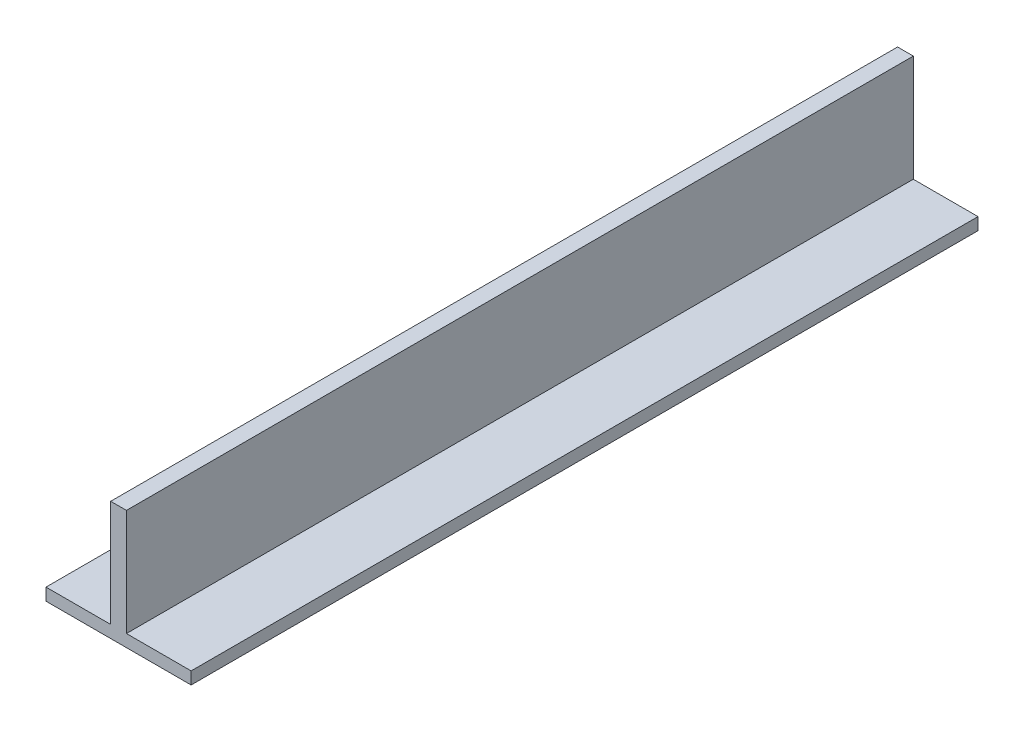
ISO-10303-21;
HEADER;
FILE_DESCRIPTION(('STEP AP214'),'2;1');
FILE_NAME('part.step','',(''),(''),'','','');
FILE_SCHEMA(('AUTOMOTIVE_DESIGN { 1 0 10303 214 1 1 1 1 }'));
ENDSEC;
DATA;
#1=APPLICATION_CONTEXT('core data for automotive mechanical design processes');
#2=APPLICATION_PROTOCOL_DEFINITION('international standard','automotive_design',2000,#1);
#3=PRODUCT_CONTEXT('',#1,'mechanical');
#4=PRODUCT('Part','Part','',(#3));
#5=PRODUCT_RELATED_PRODUCT_CATEGORY('part','',(#4));
#6=PRODUCT_DEFINITION_FORMATION('','',#4);
#7=PRODUCT_DEFINITION_CONTEXT('part definition',#1,'design');
#8=PRODUCT_DEFINITION('design','',#6,#7);
#9=PRODUCT_DEFINITION_SHAPE('','',#8);
#10=(LENGTH_UNIT() NAMED_UNIT(*) SI_UNIT(.MILLI.,.METRE.));
#11=(NAMED_UNIT(*) PLANE_ANGLE_UNIT() SI_UNIT($,.RADIAN.));
#12=(NAMED_UNIT(*) SI_UNIT($,.STERADIAN.) SOLID_ANGLE_UNIT());
#13=UNCERTAINTY_MEASURE_WITH_UNIT(LENGTH_MEASURE(1.E-05),#10,'distance_accuracy_value','');
#14=(GEOMETRIC_REPRESENTATION_CONTEXT(3) GLOBAL_UNCERTAINTY_ASSIGNED_CONTEXT((#13)) GLOBAL_UNIT_ASSIGNED_CONTEXT((#10,
#11,#12)) REPRESENTATION_CONTEXT('',''));
#15=CARTESIAN_POINT('',(0.,0.,0.));
#16=DIRECTION('',(0.,0.,1.));
#17=DIRECTION('',(1.,0.,0.));
#18=AXIS2_PLACEMENT_3D('',#15,#16,#17);
#19=CARTESIAN_POINT('',(0.,7.,450.));
#20=DIRECTION('',(1.,0.,0.));
#21=DIRECTION('',(0.,0.,-1.));
#22=AXIS2_PLACEMENT_3D('',#19,#20,#21);
#23=PLANE('',#22);
#24=DIRECTION('',(0.,0.,-1.));
#25=VECTOR('',#24,1.);
#26=CARTESIAN_POINT('',(0.,7.,450.));
#27=LINE('',#26,#25);
#28=CARTESIAN_POINT('',(0.,7.,450.));
#29=VERTEX_POINT('',#28);
#30=CARTESIAN_POINT('',(0.,7.,224.));
#31=VERTEX_POINT('',#30);
#32=EDGE_CURVE('E120',#29,#31,#27,.T.);
#33=ORIENTED_EDGE('',*,*,#32,.T.);
#34=DIRECTION('',(0.,1.,0.));
#35=VECTOR('',#34,1.);
#36=CARTESIAN_POINT('',(0.,0.,224.));
#37=LINE('',#36,#35);
#38=CARTESIAN_POINT('',(0.,0.,224.));
#39=VERTEX_POINT('',#38);
#40=EDGE_CURVE('E167',#39,#31,#37,.T.);
#41=ORIENTED_EDGE('',*,*,#40,.F.);
#42=DIRECTION('',(0.,0.,-1.));
#43=VECTOR('',#42,1.);
#44=CARTESIAN_POINT('',(0.,0.,450.));
#45=LINE('',#44,#43);
#46=CARTESIAN_POINT('',(0.,0.,450.));
#47=VERTEX_POINT('',#46);
#48=EDGE_CURVE('E11',#47,#39,#45,.T.);
#49=ORIENTED_EDGE('',*,*,#48,.F.);
#50=DIRECTION('',(0.,-1.,0.));
#51=VECTOR('',#50,1.);
#52=CARTESIAN_POINT('',(0.,7.,450.));
#53=LINE('',#52,#51);
#54=EDGE_CURVE('E135',#29,#47,#53,.T.);
#55=ORIENTED_EDGE('',*,*,#54,.F.);
#56=EDGE_LOOP('',(#33,#41,#49,#55));
#57=FACE_BOUND('',#56,.T.);
#58=ADVANCED_FACE('F32',(#57),#23,.F.);
#59=CARTESIAN_POINT('',(0.,0.,450.));
#60=DIRECTION('',(0.,1.,0.));
#61=DIRECTION('',(0.,0.,1.));
#62=AXIS2_PLACEMENT_3D('',#59,#60,#61);
#63=PLANE('',#62);
#64=DIRECTION('',(1.,0.,0.));
#65=VECTOR('',#64,1.);
#66=CARTESIAN_POINT('',(0.,0.,224.));
#67=LINE('',#66,#65);
#68=CARTESIAN_POINT('',(37.,0.,224.));
#69=VERTEX_POINT('',#68);
#70=EDGE_CURVE('E170',#39,#69,#67,.T.);
#71=ORIENTED_EDGE('',*,*,#70,.T.);
#72=DIRECTION('',(0.,0.,-1.));
#73=VECTOR('',#72,1.);
#74=CARTESIAN_POINT('',(37.,0.,224.));
#75=LINE('',#74,#73);
#76=CARTESIAN_POINT('',(37.,0.,0.));
#77=VERTEX_POINT('',#76);
#78=EDGE_CURVE('E175',#69,#77,#75,.T.);
#79=ORIENTED_EDGE('',*,*,#78,.T.);
#80=DIRECTION('',(1.,0.,0.));
#81=VECTOR('',#80,1.);
#82=CARTESIAN_POINT('',(0.,0.,0.));
#83=LINE('',#82,#81);
#84=CARTESIAN_POINT('',(83.,0.,0.));
#85=VERTEX_POINT('',#84);
#86=EDGE_CURVE('E124',#77,#85,#83,.T.);
#87=ORIENTED_EDGE('',*,*,#86,.T.);
#88=DIRECTION('',(0.,0.,-1.));
#89=VECTOR('',#88,1.);
#90=CARTESIAN_POINT('',(83.,0.,450.));
#91=LINE('',#90,#89);
#92=CARTESIAN_POINT('',(83.,0.,450.));
#93=VERTEX_POINT('',#92);
#94=EDGE_CURVE('E40',#93,#85,#91,.T.);
#95=ORIENTED_EDGE('',*,*,#94,.F.);
#96=DIRECTION('',(1.,0.,0.));
#97=VECTOR('',#96,1.);
#98=CARTESIAN_POINT('',(0.,0.,450.));
#99=LINE('',#98,#97);
#100=EDGE_CURVE('E84',#47,#93,#99,.T.);
#101=ORIENTED_EDGE('',*,*,#100,.F.);
#102=ORIENTED_EDGE('',*,*,#48,.T.);
#103=EDGE_LOOP('',(#71,#79,#87,#95,#101,#102));
#104=FACE_BOUND('',#103,.T.);
#105=ADVANCED_FACE('F180',(#104),#63,.F.);
#106=CARTESIAN_POINT('',(83.,0.,450.));
#107=DIRECTION('',(-1.,0.,0.));
#108=DIRECTION('',(0.,0.,1.));
#109=AXIS2_PLACEMENT_3D('',#106,#107,#108);
#110=PLANE('',#109);
#111=DIRECTION('',(0.,1.,0.));
#112=VECTOR('',#111,1.);
#113=CARTESIAN_POINT('',(83.,0.,0.));
#114=LINE('',#113,#112);
#115=CARTESIAN_POINT('',(83.,7.,0.));
#116=VERTEX_POINT('',#115);
#117=EDGE_CURVE('E126',#85,#116,#114,.T.);
#118=ORIENTED_EDGE('',*,*,#117,.T.);
#119=DIRECTION('',(0.,0.,-1.));
#120=VECTOR('',#119,1.);
#121=CARTESIAN_POINT('',(83.,7.,450.));
#122=LINE('',#121,#120);
#123=CARTESIAN_POINT('',(83.,7.,450.));
#124=VERTEX_POINT('',#123);
#125=EDGE_CURVE('E142',#124,#116,#122,.T.);
#126=ORIENTED_EDGE('',*,*,#125,.F.);
#127=DIRECTION('',(0.,1.,0.));
#128=VECTOR('',#127,1.);
#129=CARTESIAN_POINT('',(83.,0.,450.));
#130=LINE('',#129,#128);
#131=EDGE_CURVE('E150',#93,#124,#130,.T.);
#132=ORIENTED_EDGE('',*,*,#131,.F.);
#133=ORIENTED_EDGE('',*,*,#94,.T.);
#134=EDGE_LOOP('',(#118,#126,#132,#133));
#135=FACE_BOUND('',#134,.T.);
#136=ADVANCED_FACE('F148',(#135),#110,.F.);
#137=CARTESIAN_POINT('',(83.,7.,450.));
#138=DIRECTION('',(0.,-1.,0.));
#139=DIRECTION('',(0.,0.,-1.));
#140=AXIS2_PLACEMENT_3D('',#137,#138,#139);
#141=PLANE('',#140);
#142=DIRECTION('',(-1.,0.,0.));
#143=VECTOR('',#142,1.);
#144=CARTESIAN_POINT('',(83.,7.,0.));
#145=LINE('',#144,#143);
#146=CARTESIAN_POINT('',(46.,7.,0.));
#147=VERTEX_POINT('',#146);
#148=EDGE_CURVE('E129',#116,#147,#145,.T.);
#149=ORIENTED_EDGE('',*,*,#148,.T.);
#150=DIRECTION('',(0.,0.,-1.));
#151=VECTOR('',#150,1.);
#152=CARTESIAN_POINT('',(46.,7.,450.));
#153=LINE('',#152,#151);
#154=CARTESIAN_POINT('',(46.,7.,450.));
#155=VERTEX_POINT('',#154);
#156=EDGE_CURVE('E140',#155,#147,#153,.T.);
#157=ORIENTED_EDGE('',*,*,#156,.F.);
#158=DIRECTION('',(-1.,0.,0.));
#159=VECTOR('',#158,1.);
#160=CARTESIAN_POINT('',(83.,7.,450.));
#161=LINE('',#160,#159);
#162=EDGE_CURVE('E161',#124,#155,#161,.T.);
#163=ORIENTED_EDGE('',*,*,#162,.F.);
#164=ORIENTED_EDGE('',*,*,#125,.T.);
#165=EDGE_LOOP('',(#149,#157,#163,#164));
#166=FACE_BOUND('',#165,.T.);
#167=ADVANCED_FACE('F158',(#166),#141,.F.);
#168=CARTESIAN_POINT('',(46.,7.,450.));
#169=DIRECTION('',(-1.,0.,0.));
#170=DIRECTION('',(0.,-1.,0.));
#171=AXIS2_PLACEMENT_3D('',#168,#169,#170);
#172=PLANE('',#171);
#173=DIRECTION('',(0.,1.,0.));
#174=VECTOR('',#173,1.);
#175=CARTESIAN_POINT('',(46.,7.,0.));
#176=LINE('',#175,#174);
#177=CARTESIAN_POINT('',(46.,68.,0.));
#178=VERTEX_POINT('',#177);
#179=EDGE_CURVE('E69',#147,#178,#176,.T.);
#180=ORIENTED_EDGE('',*,*,#179,.T.);
#181=DIRECTION('',(0.,0.,-1.));
#182=VECTOR('',#181,1.);
#183=CARTESIAN_POINT('',(46.,68.,450.));
#184=LINE('',#183,#182);
#185=CARTESIAN_POINT('',(46.,68.,450.));
#186=VERTEX_POINT('',#185);
#187=EDGE_CURVE('E113',#186,#178,#184,.T.);
#188=ORIENTED_EDGE('',*,*,#187,.F.);
#189=DIRECTION('',(0.,1.,0.));
#190=VECTOR('',#189,1.);
#191=CARTESIAN_POINT('',(46.,7.,450.));
#192=LINE('',#191,#190);
#193=EDGE_CURVE('E106',#155,#186,#192,.T.);
#194=ORIENTED_EDGE('',*,*,#193,.F.);
#195=ORIENTED_EDGE('',*,*,#156,.T.);
#196=EDGE_LOOP('',(#180,#188,#194,#195));
#197=FACE_BOUND('',#196,.T.);
#198=ADVANCED_FACE('F160',(#197),#172,.F.);
#199=CARTESIAN_POINT('',(46.,68.,450.));
#200=DIRECTION('',(0.,-1.,0.));
#201=DIRECTION('',(0.,0.,-1.));
#202=AXIS2_PLACEMENT_3D('',#199,#200,#201);
#203=PLANE('',#202);
#204=DIRECTION('',(-1.,0.,0.));
#205=VECTOR('',#204,1.);
#206=CARTESIAN_POINT('',(46.,68.,0.));
#207=LINE('',#206,#205);
#208=CARTESIAN_POINT('',(37.,68.,0.));
#209=VERTEX_POINT('',#208);
#210=EDGE_CURVE('E76',#178,#209,#207,.T.);
#211=ORIENTED_EDGE('',*,*,#210,.T.);
#212=DIRECTION('',(0.,0.,-1.));
#213=VECTOR('',#212,1.);
#214=CARTESIAN_POINT('',(37.,68.,450.));
#215=LINE('',#214,#213);
#216=CARTESIAN_POINT('',(37.,68.,450.));
#217=VERTEX_POINT('',#216);
#218=EDGE_CURVE('E108',#217,#209,#215,.T.);
#219=ORIENTED_EDGE('',*,*,#218,.F.);
#220=DIRECTION('',(-1.,0.,0.));
#221=VECTOR('',#220,1.);
#222=CARTESIAN_POINT('',(46.,68.,450.));
#223=LINE('',#222,#221);
#224=EDGE_CURVE('E100',#186,#217,#223,.T.);
#225=ORIENTED_EDGE('',*,*,#224,.F.);
#226=ORIENTED_EDGE('',*,*,#187,.T.);
#227=EDGE_LOOP('',(#211,#219,#225,#226));
#228=FACE_BOUND('',#227,.T.);
#229=ADVANCED_FACE('F109',(#228),#203,.F.);
#230=CARTESIAN_POINT('',(37.,68.,450.));
#231=DIRECTION('',(1.,0.,0.));
#232=DIRECTION('',(0.,0.,-1.));
#233=AXIS2_PLACEMENT_3D('',#230,#231,#232);
#234=PLANE('',#233);
#235=DIRECTION('',(0.,-1.,0.));
#236=VECTOR('',#235,1.);
#237=CARTESIAN_POINT('',(37.,68.,0.));
#238=LINE('',#237,#236);
#239=EDGE_CURVE('E133',#209,#77,#238,.T.);
#240=ORIENTED_EDGE('',*,*,#239,.T.);
#241=ORIENTED_EDGE('',*,*,#78,.F.);
#242=DIRECTION('',(0.,1.,0.));
#243=VECTOR('',#242,1.);
#244=CARTESIAN_POINT('',(37.,0.,224.));
#245=LINE('',#244,#243);
#246=CARTESIAN_POINT('',(37.,7.,224.));
#247=VERTEX_POINT('',#246);
#248=EDGE_CURVE('E127',#69,#247,#245,.T.);
#249=ORIENTED_EDGE('',*,*,#248,.T.);
#250=DIRECTION('',(0.,0.,-1.));
#251=VECTOR('',#250,1.);
#252=CARTESIAN_POINT('',(37.,7.,450.));
#253=LINE('',#252,#251);
#254=CARTESIAN_POINT('',(37.,7.,450.));
#255=VERTEX_POINT('',#254);
#256=EDGE_CURVE('E114',#255,#247,#253,.T.);
#257=ORIENTED_EDGE('',*,*,#256,.F.);
#258=DIRECTION('',(0.,-1.,0.));
#259=VECTOR('',#258,1.);
#260=CARTESIAN_POINT('',(37.,68.,450.));
#261=LINE('',#260,#259);
#262=EDGE_CURVE('E103',#217,#255,#261,.T.);
#263=ORIENTED_EDGE('',*,*,#262,.F.);
#264=ORIENTED_EDGE('',*,*,#218,.T.);
#265=EDGE_LOOP('',(#240,#241,#249,#257,#263,#264));
#266=FACE_BOUND('',#265,.T.);
#267=ADVANCED_FACE('F116',(#266),#234,.F.);
#268=CARTESIAN_POINT('',(37.,7.,450.));
#269=DIRECTION('',(0.,-1.,0.));
#270=DIRECTION('',(1.,0.,0.));
#271=AXIS2_PLACEMENT_3D('',#268,#269,#270);
#272=PLANE('',#271);
#273=ORIENTED_EDGE('',*,*,#256,.T.);
#274=DIRECTION('',(1.,0.,0.));
#275=VECTOR('',#274,1.);
#276=CARTESIAN_POINT('',(0.,7.,224.));
#277=LINE('',#276,#275);
#278=EDGE_CURVE('E172',#31,#247,#277,.T.);
#279=ORIENTED_EDGE('',*,*,#278,.F.);
#280=ORIENTED_EDGE('',*,*,#32,.F.);
#281=DIRECTION('',(-1.,0.,0.));
#282=VECTOR('',#281,1.);
#283=CARTESIAN_POINT('',(37.,7.,450.));
#284=LINE('',#283,#282);
#285=EDGE_CURVE('E48',#255,#29,#284,.T.);
#286=ORIENTED_EDGE('',*,*,#285,.F.);
#287=EDGE_LOOP('',(#273,#279,#280,#286));
#288=FACE_BOUND('',#287,.T.);
#289=ADVANCED_FACE('F195',(#288),#272,.F.);
#290=CARTESIAN_POINT('',(0.,0.,450.));
#291=DIRECTION('',(0.,0.,1.));
#292=DIRECTION('',(1.,0.,0.));
#293=AXIS2_PLACEMENT_3D('',#290,#291,#292);
#294=PLANE('',#293);
#295=ORIENTED_EDGE('',*,*,#54,.T.);
#296=ORIENTED_EDGE('',*,*,#100,.T.);
#297=ORIENTED_EDGE('',*,*,#131,.T.);
#298=ORIENTED_EDGE('',*,*,#162,.T.);
#299=ORIENTED_EDGE('',*,*,#193,.T.);
#300=ORIENTED_EDGE('',*,*,#224,.T.);
#301=ORIENTED_EDGE('',*,*,#262,.T.);
#302=ORIENTED_EDGE('',*,*,#285,.T.);
#303=EDGE_LOOP('',(#295,#296,#297,#298,#299,#300,#301,#302));
#304=FACE_BOUND('',#303,.T.);
#305=ADVANCED_FACE('F101',(#304),#294,.T.);
#306=CARTESIAN_POINT('',(0.,0.,0.));
#307=DIRECTION('',(0.,0.,1.));
#308=DIRECTION('',(1.,0.,0.));
#309=AXIS2_PLACEMENT_3D('',#306,#307,#308);
#310=PLANE('',#309);
#311=ORIENTED_EDGE('',*,*,#86,.F.);
#312=ORIENTED_EDGE('',*,*,#239,.F.);
#313=ORIENTED_EDGE('',*,*,#210,.F.);
#314=ORIENTED_EDGE('',*,*,#179,.F.);
#315=ORIENTED_EDGE('',*,*,#148,.F.);
#316=ORIENTED_EDGE('',*,*,#117,.F.);
#317=EDGE_LOOP('',(#311,#312,#313,#314,#315,#316));
#318=FACE_BOUND('',#317,.T.);
#319=ADVANCED_FACE('F154',(#318),#310,.F.);
#320=CARTESIAN_POINT('',(0.,0.,224.));
#321=DIRECTION('',(0.,0.,1.));
#322=DIRECTION('',(1.,0.,0.));
#323=AXIS2_PLACEMENT_3D('',#320,#321,#322);
#324=PLANE('',#323);
#325=ORIENTED_EDGE('',*,*,#278,.T.);
#326=ORIENTED_EDGE('',*,*,#248,.F.);
#327=ORIENTED_EDGE('',*,*,#70,.F.);
#328=ORIENTED_EDGE('',*,*,#40,.T.);
#329=EDGE_LOOP('',(#325,#326,#327,#328));
#330=FACE_BOUND('',#329,.T.);
#331=ADVANCED_FACE('F191',(#330),#324,.F.);
#332=CLOSED_SHELL('',(#58,#105,#136,#167,#198,#229,#267,#289,#305,#319,#331));
#333=MANIFOLD_SOLID_BREP('B2',#332);
#334=ADVANCED_BREP_SHAPE_REPRESENTATION('',(#18,#333),#14);
#335=SHAPE_DEFINITION_REPRESENTATION(#9,#334);
ENDSEC;
END-ISO-10303-21;
